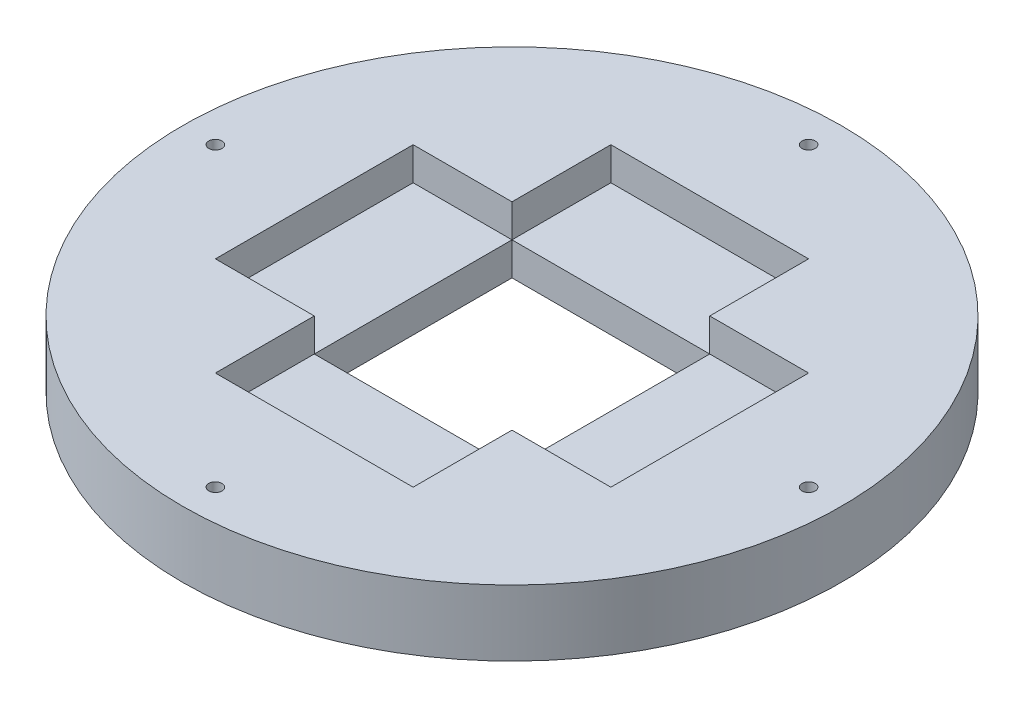
ISO-10303-21;
HEADER;
FILE_DESCRIPTION(('STEP AP214'),'2;1');
FILE_NAME('part.step','',(''),(''),'','','');
FILE_SCHEMA(('AUTOMOTIVE_DESIGN { 1 0 10303 214 1 1 1 1 }'));
ENDSEC;
DATA;
#1=APPLICATION_CONTEXT('core data for automotive mechanical design processes');
#2=APPLICATION_PROTOCOL_DEFINITION('international standard','automotive_design',2000,#1);
#3=PRODUCT_CONTEXT('',#1,'mechanical');
#4=PRODUCT('Part','Part','',(#3));
#5=PRODUCT_RELATED_PRODUCT_CATEGORY('part','',(#4));
#6=PRODUCT_DEFINITION_FORMATION('','',#4);
#7=PRODUCT_DEFINITION_CONTEXT('part definition',#1,'design');
#8=PRODUCT_DEFINITION('design','',#6,#7);
#9=PRODUCT_DEFINITION_SHAPE('','',#8);
#10=(LENGTH_UNIT() NAMED_UNIT(*) SI_UNIT(.MILLI.,.METRE.));
#11=(NAMED_UNIT(*) PLANE_ANGLE_UNIT() SI_UNIT($,.RADIAN.));
#12=(NAMED_UNIT(*) SI_UNIT($,.STERADIAN.) SOLID_ANGLE_UNIT());
#13=UNCERTAINTY_MEASURE_WITH_UNIT(LENGTH_MEASURE(1.E-05),#10,'distance_accuracy_value','');
#14=(GEOMETRIC_REPRESENTATION_CONTEXT(3) GLOBAL_UNCERTAINTY_ASSIGNED_CONTEXT((#13)) GLOBAL_UNIT_ASSIGNED_CONTEXT((#10,
#11,#12)) REPRESENTATION_CONTEXT('',''));
#15=CARTESIAN_POINT('',(0.,0.,0.));
#16=DIRECTION('',(0.,0.,1.));
#17=DIRECTION('',(1.,0.,0.));
#18=AXIS2_PLACEMENT_3D('',#15,#16,#17);
#19=CARTESIAN_POINT('',(-30.,20.,0.));
#20=DIRECTION('',(1.,0.,0.));
#21=DIRECTION('',(0.,0.,-1.));
#22=AXIS2_PLACEMENT_3D('',#19,#20,#21);
#23=PLANE('',#22);
#24=DIRECTION('',(0.,0.,1.));
#25=VECTOR('',#24,1.);
#26=CARTESIAN_POINT('',(-30.,10.,0.));
#27=LINE('',#26,#25);
#28=CARTESIAN_POINT('',(-30.,10.,30.));
#29=VERTEX_POINT('',#28);
#30=CARTESIAN_POINT('',(-30.,10.,60.));
#31=VERTEX_POINT('',#30);
#32=EDGE_CURVE('E233',#29,#31,#27,.T.);
#33=ORIENTED_EDGE('',*,*,#32,.F.);
#34=DIRECTION('',(0.,1.,0.));
#35=VECTOR('',#34,1.);
#36=CARTESIAN_POINT('',(-30.,10.,30.));
#37=LINE('',#36,#35);
#38=CARTESIAN_POINT('',(-30.,20.,30.));
#39=VERTEX_POINT('',#38);
#40=EDGE_CURVE('E176',#29,#39,#37,.T.);
#41=ORIENTED_EDGE('',*,*,#40,.T.);
#42=DIRECTION('',(0.,0.,1.));
#43=VECTOR('',#42,1.);
#44=CARTESIAN_POINT('',(-30.,20.,0.));
#45=LINE('',#44,#43);
#46=CARTESIAN_POINT('',(-30.,20.,60.));
#47=VERTEX_POINT('',#46);
#48=EDGE_CURVE('E249',#39,#47,#45,.T.);
#49=ORIENTED_EDGE('',*,*,#48,.T.);
#50=DIRECTION('',(0.,1.,0.));
#51=VECTOR('',#50,1.);
#52=CARTESIAN_POINT('',(-30.,10.,60.));
#53=LINE('',#52,#51);
#54=EDGE_CURVE('E239',#31,#47,#53,.T.);
#55=ORIENTED_EDGE('',*,*,#54,.F.);
#56=EDGE_LOOP('',(#33,#41,#49,#55));
#57=FACE_BOUND('',#56,.T.);
#58=ADVANCED_FACE('F33',(#57),#23,.T.);
#59=DIRECTION('',(0.,-1.,0.));
#60=VECTOR('',#59,1.);
#61=CARTESIAN_POINT('',(-30.,20.,-30.));
#62=LINE('',#61,#60);
#63=CARTESIAN_POINT('',(-30.,10.,-30.));
#64=VERTEX_POINT('',#63);
#65=CARTESIAN_POINT('',(-30.,0.,-30.));
#66=VERTEX_POINT('',#65);
#67=EDGE_CURVE('E48',#64,#66,#62,.T.);
#68=ORIENTED_EDGE('',*,*,#67,.F.);
#69=DIRECTION('',(0.,0.,-1.));
#70=VECTOR('',#69,1.);
#71=CARTESIAN_POINT('',(-30.,10.,0.));
#72=LINE('',#71,#70);
#73=EDGE_CURVE('E148',#29,#64,#72,.T.);
#74=ORIENTED_EDGE('',*,*,#73,.F.);
#75=DIRECTION('',(0.,-1.,0.));
#76=VECTOR('',#75,1.);
#77=CARTESIAN_POINT('',(-30.,20.,30.));
#78=LINE('',#77,#76);
#79=CARTESIAN_POINT('',(-30.,0.,30.));
#80=VERTEX_POINT('',#79);
#81=EDGE_CURVE('E56',#29,#80,#78,.T.);
#82=ORIENTED_EDGE('',*,*,#81,.T.);
#83=DIRECTION('',(0.,0.,1.));
#84=VECTOR('',#83,1.);
#85=CARTESIAN_POINT('',(-30.,0.,0.));
#86=LINE('',#85,#84);
#87=EDGE_CURVE('E264',#66,#80,#86,.T.);
#88=ORIENTED_EDGE('',*,*,#87,.F.);
#89=EDGE_LOOP('',(#68,#74,#82,#88));
#90=FACE_BOUND('',#89,.T.);
#91=ADVANCED_FACE('F283',(#90),#23,.T.);
#92=CARTESIAN_POINT('',(30.,20.,0.));
#93=DIRECTION('',(1.,0.,0.));
#94=DIRECTION('',(0.,0.,-1.));
#95=AXIS2_PLACEMENT_3D('',#92,#93,#94);
#96=PLANE('',#95);
#97=DIRECTION('',(0.,1.,0.));
#98=VECTOR('',#97,1.);
#99=CARTESIAN_POINT('',(30.,10.,-30.));
#100=LINE('',#99,#98);
#101=CARTESIAN_POINT('',(30.,10.,-30.));
#102=VERTEX_POINT('',#101);
#103=CARTESIAN_POINT('',(30.,20.,-30.));
#104=VERTEX_POINT('',#103);
#105=EDGE_CURVE('E203',#102,#104,#100,.T.);
#106=ORIENTED_EDGE('',*,*,#105,.T.);
#107=DIRECTION('',(0.,0.,1.));
#108=VECTOR('',#107,1.);
#109=CARTESIAN_POINT('',(30.,20.,0.));
#110=LINE('',#109,#108);
#111=CARTESIAN_POINT('',(30.,20.,-60.));
#112=VERTEX_POINT('',#111);
#113=EDGE_CURVE('E246',#112,#104,#110,.T.);
#114=ORIENTED_EDGE('',*,*,#113,.F.);
#115=DIRECTION('',(0.,1.,0.));
#116=VECTOR('',#115,1.);
#117=CARTESIAN_POINT('',(30.,10.,-60.));
#118=LINE('',#117,#116);
#119=CARTESIAN_POINT('',(30.,10.,-60.));
#120=VERTEX_POINT('',#119);
#121=EDGE_CURVE('E218',#120,#112,#118,.T.);
#122=ORIENTED_EDGE('',*,*,#121,.F.);
#123=DIRECTION('',(0.,0.,-1.));
#124=VECTOR('',#123,1.);
#125=CARTESIAN_POINT('',(30.,10.,0.));
#126=LINE('',#125,#124);
#127=EDGE_CURVE('E210',#102,#120,#126,.T.);
#128=ORIENTED_EDGE('',*,*,#127,.F.);
#129=EDGE_LOOP('',(#106,#114,#122,#128));
#130=FACE_BOUND('',#129,.T.);
#131=ADVANCED_FACE('F316',(#130),#96,.F.);
#132=DIRECTION('',(0.,0.,1.));
#133=VECTOR('',#132,1.);
#134=CARTESIAN_POINT('',(30.,10.,0.));
#135=LINE('',#134,#133);
#136=CARTESIAN_POINT('',(30.,10.,30.));
#137=VERTEX_POINT('',#136);
#138=EDGE_CURVE('E185',#102,#137,#135,.T.);
#139=ORIENTED_EDGE('',*,*,#138,.F.);
#140=DIRECTION('',(0.,-1.,0.));
#141=VECTOR('',#140,1.);
#142=CARTESIAN_POINT('',(30.,20.,-30.));
#143=LINE('',#142,#141);
#144=CARTESIAN_POINT('',(30.,0.,-30.));
#145=VERTEX_POINT('',#144);
#146=EDGE_CURVE('E11',#102,#145,#143,.T.);
#147=ORIENTED_EDGE('',*,*,#146,.T.);
#148=DIRECTION('',(0.,0.,1.));
#149=VECTOR('',#148,1.);
#150=CARTESIAN_POINT('',(30.,0.,0.));
#151=LINE('',#150,#149);
#152=CARTESIAN_POINT('',(30.,0.,30.));
#153=VERTEX_POINT('',#152);
#154=EDGE_CURVE('E258',#145,#153,#151,.T.);
#155=ORIENTED_EDGE('',*,*,#154,.T.);
#156=DIRECTION('',(0.,-1.,0.));
#157=VECTOR('',#156,1.);
#158=CARTESIAN_POINT('',(30.,20.,30.));
#159=LINE('',#158,#157);
#160=EDGE_CURVE('E41',#137,#153,#159,.T.);
#161=ORIENTED_EDGE('',*,*,#160,.F.);
#162=EDGE_LOOP('',(#139,#147,#155,#161));
#163=FACE_BOUND('',#162,.T.);
#164=ADVANCED_FACE('F278',(#163),#96,.F.);
#165=CARTESIAN_POINT('',(0.,20.,-30.));
#166=DIRECTION('',(0.,0.,-1.));
#167=DIRECTION('',(-1.,0.,0.));
#168=AXIS2_PLACEMENT_3D('',#165,#166,#167);
#169=PLANE('',#168);
#170=DIRECTION('',(1.,0.,0.));
#171=VECTOR('',#170,1.);
#172=CARTESIAN_POINT('',(0.,10.,-30.));
#173=LINE('',#172,#171);
#174=EDGE_CURVE('E207',#64,#102,#173,.T.);
#175=ORIENTED_EDGE('',*,*,#174,.F.);
#176=ORIENTED_EDGE('',*,*,#67,.T.);
#177=DIRECTION('',(1.,0.,0.));
#178=VECTOR('',#177,1.);
#179=CARTESIAN_POINT('',(0.,0.,-30.));
#180=LINE('',#179,#178);
#181=EDGE_CURVE('E225',#66,#145,#180,.T.);
#182=ORIENTED_EDGE('',*,*,#181,.T.);
#183=ORIENTED_EDGE('',*,*,#146,.F.);
#184=EDGE_LOOP('',(#175,#176,#182,#183));
#185=FACE_BOUND('',#184,.T.);
#186=ADVANCED_FACE('F35',(#185),#169,.F.);
#187=CARTESIAN_POINT('',(0.,20.,30.));
#188=DIRECTION('',(0.,0.,-1.));
#189=DIRECTION('',(-1.,0.,0.));
#190=AXIS2_PLACEMENT_3D('',#187,#188,#189);
#191=PLANE('',#190);
#192=ORIENTED_EDGE('',*,*,#81,.F.);
#193=DIRECTION('',(-1.,0.,0.));
#194=VECTOR('',#193,1.);
#195=CARTESIAN_POINT('',(0.,10.,30.));
#196=LINE('',#195,#194);
#197=EDGE_CURVE('E230',#137,#29,#196,.T.);
#198=ORIENTED_EDGE('',*,*,#197,.F.);
#199=ORIENTED_EDGE('',*,*,#160,.T.);
#200=DIRECTION('',(1.,0.,0.));
#201=VECTOR('',#200,1.);
#202=CARTESIAN_POINT('',(0.,0.,30.));
#203=LINE('',#202,#201);
#204=EDGE_CURVE('E261',#80,#153,#203,.T.);
#205=ORIENTED_EDGE('',*,*,#204,.F.);
#206=EDGE_LOOP('',(#192,#198,#199,#205));
#207=FACE_BOUND('',#206,.T.);
#208=ADVANCED_FACE('F274',(#207),#191,.T.);
#209=CARTESIAN_POINT('',(0.,20.,0.));
#210=DIRECTION('',(0.,1.,0.));
#211=DIRECTION('',(0.,0.,1.));
#212=AXIS2_PLACEMENT_3D('',#209,#210,#211);
#213=PLANE('',#212);
#214=CARTESIAN_POINT('',(0.,20.,-90.));
#215=DIRECTION('',(0.,1.,0.));
#216=DIRECTION('',(0.,0.,1.));
#217=AXIS2_PLACEMENT_3D('',#214,#215,#216);
#218=CIRCLE('',#217,2.);
#219=CARTESIAN_POINT('',(0.,20.,-88.));
#220=VERTEX_POINT('',#219);
#221=EDGE_CURVE('E410',#220,#220,#218,.T.);
#222=ORIENTED_EDGE('',*,*,#221,.F.);
#223=EDGE_LOOP('',(#222));
#224=FACE_BOUND('',#223,.T.);
#225=CARTESIAN_POINT('',(90.,20.,0.));
#226=DIRECTION('',(0.,1.,0.));
#227=DIRECTION('',(0.,0.,1.));
#228=AXIS2_PLACEMENT_3D('',#225,#226,#227);
#229=CIRCLE('',#228,2.);
#230=CARTESIAN_POINT('',(90.,20.,2.));
#231=VERTEX_POINT('',#230);
#232=EDGE_CURVE('E406',#231,#231,#229,.T.);
#233=ORIENTED_EDGE('',*,*,#232,.F.);
#234=EDGE_LOOP('',(#233));
#235=FACE_BOUND('',#234,.T.);
#236=CARTESIAN_POINT('',(0.,20.,90.));
#237=DIRECTION('',(0.,1.,0.));
#238=DIRECTION('',(0.,0.,1.));
#239=AXIS2_PLACEMENT_3D('',#236,#237,#238);
#240=CIRCLE('',#239,2.00000000000001);
#241=CARTESIAN_POINT('',(0.,20.,92.));
#242=VERTEX_POINT('',#241);
#243=EDGE_CURVE('E400',#242,#242,#240,.T.);
#244=ORIENTED_EDGE('',*,*,#243,.F.);
#245=EDGE_LOOP('',(#244));
#246=FACE_BOUND('',#245,.T.);
#247=CARTESIAN_POINT('',(-90.,20.,0.));
#248=DIRECTION('',(0.,1.,0.));
#249=DIRECTION('',(0.,0.,1.));
#250=AXIS2_PLACEMENT_3D('',#247,#248,#249);
#251=CIRCLE('',#250,2.00000000000001);
#252=CARTESIAN_POINT('',(-90.,20.,2.00000000000001));
#253=VERTEX_POINT('',#252);
#254=EDGE_CURVE('E165',#253,#253,#251,.T.);
#255=ORIENTED_EDGE('',*,*,#254,.F.);
#256=EDGE_LOOP('',(#255));
#257=FACE_BOUND('',#256,.T.);
#258=DIRECTION('',(-1.,0.,0.));
#259=VECTOR('',#258,1.);
#260=CARTESIAN_POINT('',(0.,20.,-30.));
#261=LINE('',#260,#259);
#262=CARTESIAN_POINT('',(-30.,20.,-30.));
#263=VERTEX_POINT('',#262);
#264=CARTESIAN_POINT('',(-60.,20.,-30.));
#265=VERTEX_POINT('',#264);
#266=EDGE_CURVE('E143',#263,#265,#261,.T.);
#267=ORIENTED_EDGE('',*,*,#266,.F.);
#268=CARTESIAN_POINT('',(-30.,20.,-60.));
#269=VERTEX_POINT('',#268);
#270=EDGE_CURVE('E251',#269,#263,#45,.T.);
#271=ORIENTED_EDGE('',*,*,#270,.F.);
#272=DIRECTION('',(1.,0.,0.));
#273=VECTOR('',#272,1.);
#274=CARTESIAN_POINT('',(0.,20.,-60.));
#275=LINE('',#274,#273);
#276=EDGE_CURVE('E211',#269,#112,#275,.T.);
#277=ORIENTED_EDGE('',*,*,#276,.T.);
#278=ORIENTED_EDGE('',*,*,#113,.T.);
#279=DIRECTION('',(1.,0.,0.));
#280=VECTOR('',#279,1.);
#281=CARTESIAN_POINT('',(0.,20.,-30.));
#282=LINE('',#281,#280);
#283=CARTESIAN_POINT('',(60.,20.,-30.));
#284=VERTEX_POINT('',#283);
#285=EDGE_CURVE('E193',#104,#284,#282,.T.);
#286=ORIENTED_EDGE('',*,*,#285,.T.);
#287=DIRECTION('',(0.,0.,1.));
#288=VECTOR('',#287,1.);
#289=CARTESIAN_POINT('',(60.,20.,0.));
#290=LINE('',#289,#288);
#291=CARTESIAN_POINT('',(60.,20.,30.));
#292=VERTEX_POINT('',#291);
#293=EDGE_CURVE('E175',#284,#292,#290,.T.);
#294=ORIENTED_EDGE('',*,*,#293,.T.);
#295=DIRECTION('',(1.,0.,0.));
#296=VECTOR('',#295,1.);
#297=CARTESIAN_POINT('',(0.,20.,30.));
#298=LINE('',#297,#296);
#299=CARTESIAN_POINT('',(30.,20.,30.));
#300=VERTEX_POINT('',#299);
#301=EDGE_CURVE('E183',#300,#292,#298,.T.);
#302=ORIENTED_EDGE('',*,*,#301,.F.);
#303=CARTESIAN_POINT('',(30.,20.,60.));
#304=VERTEX_POINT('',#303);
#305=EDGE_CURVE('E250',#300,#304,#110,.T.);
#306=ORIENTED_EDGE('',*,*,#305,.T.);
#307=DIRECTION('',(1.,0.,0.));
#308=VECTOR('',#307,1.);
#309=CARTESIAN_POINT('',(0.,20.,60.));
#310=LINE('',#309,#308);
#311=EDGE_CURVE('E200',#47,#304,#310,.T.);
#312=ORIENTED_EDGE('',*,*,#311,.F.);
#313=ORIENTED_EDGE('',*,*,#48,.F.);
#314=DIRECTION('',(-1.,0.,0.));
#315=VECTOR('',#314,1.);
#316=CARTESIAN_POINT('',(0.,20.,30.));
#317=LINE('',#316,#315);
#318=CARTESIAN_POINT('',(-60.,20.,30.));
#319=VERTEX_POINT('',#318);
#320=EDGE_CURVE('E159',#39,#319,#317,.T.);
#321=ORIENTED_EDGE('',*,*,#320,.T.);
#322=DIRECTION('',(0.,0.,1.));
#323=VECTOR('',#322,1.);
#324=CARTESIAN_POINT('',(-60.,20.,0.));
#325=LINE('',#324,#323);
#326=EDGE_CURVE('E162',#265,#319,#325,.T.);
#327=ORIENTED_EDGE('',*,*,#326,.F.);
#328=EDGE_LOOP('',(#267,#271,#277,#278,#286,#294,#302,#306,#312,#313,#321,#327));
#329=FACE_BOUND('',#328,.T.);
#330=CARTESIAN_POINT('',(0.,20.,0.));
#331=DIRECTION('',(0.,1.,0.));
#332=DIRECTION('',(0.,0.,1.));
#333=AXIS2_PLACEMENT_3D('',#330,#331,#332);
#334=CIRCLE('',#333,100.);
#335=CARTESIAN_POINT('',(0.,20.,100.));
#336=VERTEX_POINT('',#335);
#337=EDGE_CURVE('E254',#336,#336,#334,.T.);
#338=ORIENTED_EDGE('',*,*,#337,.T.);
#339=EDGE_LOOP('',(#338));
#340=FACE_BOUND('',#339,.T.);
#341=ADVANCED_FACE('F301',(#224,#235,#246,#257,#329,#340),#213,.T.);
#342=ORIENTED_EDGE('',*,*,#305,.F.);
#343=DIRECTION('',(0.,1.,0.));
#344=VECTOR('',#343,1.);
#345=CARTESIAN_POINT('',(30.,10.,30.));
#346=LINE('',#345,#344);
#347=EDGE_CURVE('E201',#137,#300,#346,.T.);
#348=ORIENTED_EDGE('',*,*,#347,.F.);
#349=DIRECTION('',(0.,0.,1.));
#350=VECTOR('',#349,1.);
#351=CARTESIAN_POINT('',(30.,10.,0.));
#352=LINE('',#351,#350);
#353=CARTESIAN_POINT('',(30.,10.,60.));
#354=VERTEX_POINT('',#353);
#355=EDGE_CURVE('E228',#137,#354,#352,.T.);
#356=ORIENTED_EDGE('',*,*,#355,.T.);
#357=DIRECTION('',(0.,1.,0.));
#358=VECTOR('',#357,1.);
#359=CARTESIAN_POINT('',(30.,10.,60.));
#360=LINE('',#359,#358);
#361=EDGE_CURVE('E221',#354,#304,#360,.T.);
#362=ORIENTED_EDGE('',*,*,#361,.T.);
#363=EDGE_LOOP('',(#342,#348,#356,#362));
#364=FACE_BOUND('',#363,.T.);
#365=ADVANCED_FACE('F296',(#364),#96,.F.);
#366=DIRECTION('',(0.,1.,0.));
#367=VECTOR('',#366,1.);
#368=CARTESIAN_POINT('',(-30.,10.,-30.));
#369=LINE('',#368,#367);
#370=EDGE_CURVE('E173',#64,#263,#369,.T.);
#371=ORIENTED_EDGE('',*,*,#370,.F.);
#372=DIRECTION('',(0.,0.,-1.));
#373=VECTOR('',#372,1.);
#374=CARTESIAN_POINT('',(-30.,10.,0.));
#375=LINE('',#374,#373);
#376=CARTESIAN_POINT('',(-30.,10.,-60.));
#377=VERTEX_POINT('',#376);
#378=EDGE_CURVE('E216',#64,#377,#375,.T.);
#379=ORIENTED_EDGE('',*,*,#378,.T.);
#380=DIRECTION('',(0.,1.,0.));
#381=VECTOR('',#380,1.);
#382=CARTESIAN_POINT('',(-30.,10.,-60.));
#383=LINE('',#382,#381);
#384=EDGE_CURVE('E222',#377,#269,#383,.T.);
#385=ORIENTED_EDGE('',*,*,#384,.T.);
#386=ORIENTED_EDGE('',*,*,#270,.T.);
#387=EDGE_LOOP('',(#371,#379,#385,#386));
#388=FACE_BOUND('',#387,.T.);
#389=ADVANCED_FACE('F329',(#388),#23,.T.);
#390=CARTESIAN_POINT('',(0.,20.,0.));
#391=DIRECTION('',(0.,-1.,0.));
#392=DIRECTION('',(0.,0.,-1.));
#393=AXIS2_PLACEMENT_3D('',#390,#391,#392);
#394=CYLINDRICAL_SURFACE('',#393,100.);
#395=ORIENTED_EDGE('',*,*,#337,.F.);
#396=EDGE_LOOP('',(#395));
#397=FACE_BOUND('',#396,.T.);
#398=CARTESIAN_POINT('',(0.,0.,0.));
#399=DIRECTION('',(0.,1.,0.));
#400=DIRECTION('',(0.,0.,1.));
#401=AXIS2_PLACEMENT_3D('',#398,#399,#400);
#402=CIRCLE('',#401,100.);
#403=CARTESIAN_POINT('',(0.,0.,100.));
#404=VERTEX_POINT('',#403);
#405=EDGE_CURVE('E267',#404,#404,#402,.T.);
#406=ORIENTED_EDGE('',*,*,#405,.T.);
#407=EDGE_LOOP('',(#406));
#408=FACE_BOUND('',#407,.T.);
#409=ADVANCED_FACE('F335',(#397,#408),#394,.T.);
#410=CARTESIAN_POINT('',(0.,0.,0.));
#411=DIRECTION('',(0.,1.,0.));
#412=DIRECTION('',(0.,0.,1.));
#413=AXIS2_PLACEMENT_3D('',#410,#411,#412);
#414=PLANE('',#413);
#415=CARTESIAN_POINT('',(0.,0.,-90.));
#416=DIRECTION('',(0.,1.,0.));
#417=DIRECTION('',(0.,0.,1.));
#418=AXIS2_PLACEMENT_3D('',#415,#416,#417);
#419=CIRCLE('',#418,2.);
#420=CARTESIAN_POINT('',(0.,0.,-88.));
#421=VERTEX_POINT('',#420);
#422=EDGE_CURVE('E171',#421,#421,#419,.T.);
#423=ORIENTED_EDGE('',*,*,#422,.T.);
#424=EDGE_LOOP('',(#423));
#425=FACE_BOUND('',#424,.T.);
#426=CARTESIAN_POINT('',(90.,0.,0.));
#427=DIRECTION('',(0.,1.,0.));
#428=DIRECTION('',(0.,0.,1.));
#429=AXIS2_PLACEMENT_3D('',#426,#427,#428);
#430=CIRCLE('',#429,2.);
#431=CARTESIAN_POINT('',(90.,0.,2.));
#432=VERTEX_POINT('',#431);
#433=EDGE_CURVE('E391',#432,#432,#430,.T.);
#434=ORIENTED_EDGE('',*,*,#433,.T.);
#435=EDGE_LOOP('',(#434));
#436=FACE_BOUND('',#435,.T.);
#437=CARTESIAN_POINT('',(0.,0.,90.));
#438=DIRECTION('',(0.,1.,0.));
#439=DIRECTION('',(0.,0.,1.));
#440=AXIS2_PLACEMENT_3D('',#437,#438,#439);
#441=CIRCLE('',#440,2.00000000000001);
#442=CARTESIAN_POINT('',(0.,0.,92.));
#443=VERTEX_POINT('',#442);
#444=EDGE_CURVE('E395',#443,#443,#441,.T.);
#445=ORIENTED_EDGE('',*,*,#444,.T.);
#446=EDGE_LOOP('',(#445));
#447=FACE_BOUND('',#446,.T.);
#448=CARTESIAN_POINT('',(-90.,0.,0.));
#449=DIRECTION('',(0.,1.,0.));
#450=DIRECTION('',(0.,0.,1.));
#451=AXIS2_PLACEMENT_3D('',#448,#449,#450);
#452=CIRCLE('',#451,2.00000000000001);
#453=CARTESIAN_POINT('',(-90.,0.,2.00000000000001));
#454=VERTEX_POINT('',#453);
#455=EDGE_CURVE('E398',#454,#454,#452,.T.);
#456=ORIENTED_EDGE('',*,*,#455,.T.);
#457=EDGE_LOOP('',(#456));
#458=FACE_BOUND('',#457,.T.);
#459=ORIENTED_EDGE('',*,*,#181,.F.);
#460=ORIENTED_EDGE('',*,*,#87,.T.);
#461=ORIENTED_EDGE('',*,*,#204,.T.);
#462=ORIENTED_EDGE('',*,*,#154,.F.);
#463=EDGE_LOOP('',(#459,#460,#461,#462));
#464=FACE_BOUND('',#463,.T.);
#465=ORIENTED_EDGE('',*,*,#405,.F.);
#466=EDGE_LOOP('',(#465));
#467=FACE_BOUND('',#466,.T.);
#468=ADVANCED_FACE('F281',(#425,#436,#447,#458,#464,#467),#414,.F.);
#469=CARTESIAN_POINT('',(0.,10.,60.));
#470=DIRECTION('',(0.,0.,1.));
#471=DIRECTION('',(1.,0.,0.));
#472=AXIS2_PLACEMENT_3D('',#469,#470,#471);
#473=PLANE('',#472);
#474=ORIENTED_EDGE('',*,*,#311,.T.);
#475=ORIENTED_EDGE('',*,*,#361,.F.);
#476=DIRECTION('',(1.,0.,0.));
#477=VECTOR('',#476,1.);
#478=CARTESIAN_POINT('',(0.,10.,60.));
#479=LINE('',#478,#477);
#480=EDGE_CURVE('E236',#31,#354,#479,.T.);
#481=ORIENTED_EDGE('',*,*,#480,.F.);
#482=ORIENTED_EDGE('',*,*,#54,.T.);
#483=EDGE_LOOP('',(#474,#475,#481,#482));
#484=FACE_BOUND('',#483,.T.);
#485=ADVANCED_FACE('F298',(#484),#473,.F.);
#486=CARTESIAN_POINT('',(0.,10.,0.));
#487=DIRECTION('',(0.,1.,0.));
#488=DIRECTION('',(0.,0.,1.));
#489=AXIS2_PLACEMENT_3D('',#486,#487,#488);
#490=PLANE('',#489);
#491=ORIENTED_EDGE('',*,*,#355,.F.);
#492=ORIENTED_EDGE('',*,*,#197,.T.);
#493=ORIENTED_EDGE('',*,*,#32,.T.);
#494=ORIENTED_EDGE('',*,*,#480,.T.);
#495=EDGE_LOOP('',(#491,#492,#493,#494));
#496=FACE_BOUND('',#495,.T.);
#497=ADVANCED_FACE('F291',(#496),#490,.T.);
#498=CARTESIAN_POINT('',(0.,10.,-60.));
#499=DIRECTION('',(0.,0.,1.));
#500=DIRECTION('',(1.,0.,0.));
#501=AXIS2_PLACEMENT_3D('',#498,#499,#500);
#502=PLANE('',#501);
#503=ORIENTED_EDGE('',*,*,#276,.F.);
#504=ORIENTED_EDGE('',*,*,#384,.F.);
#505=DIRECTION('',(1.,0.,0.));
#506=VECTOR('',#505,1.);
#507=CARTESIAN_POINT('',(0.,10.,-60.));
#508=LINE('',#507,#506);
#509=EDGE_CURVE('E214',#377,#120,#508,.T.);
#510=ORIENTED_EDGE('',*,*,#509,.T.);
#511=ORIENTED_EDGE('',*,*,#121,.T.);
#512=EDGE_LOOP('',(#503,#504,#510,#511));
#513=FACE_BOUND('',#512,.T.);
#514=ADVANCED_FACE('F370',(#513),#502,.T.);
#515=CARTESIAN_POINT('',(0.,10.,0.));
#516=DIRECTION('',(0.,1.,0.));
#517=DIRECTION('',(0.,0.,1.));
#518=AXIS2_PLACEMENT_3D('',#515,#516,#517);
#519=PLANE('',#518);
#520=ORIENTED_EDGE('',*,*,#174,.T.);
#521=ORIENTED_EDGE('',*,*,#127,.T.);
#522=ORIENTED_EDGE('',*,*,#509,.F.);
#523=ORIENTED_EDGE('',*,*,#378,.F.);
#524=EDGE_LOOP('',(#520,#521,#522,#523));
#525=FACE_BOUND('',#524,.T.);
#526=ADVANCED_FACE('F320',(#525),#519,.T.);
#527=CARTESIAN_POINT('',(60.,10.,0.));
#528=DIRECTION('',(-1.,0.,0.));
#529=DIRECTION('',(0.,0.,1.));
#530=AXIS2_PLACEMENT_3D('',#527,#528,#529);
#531=PLANE('',#530);
#532=ORIENTED_EDGE('',*,*,#293,.F.);
#533=DIRECTION('',(0.,1.,0.));
#534=VECTOR('',#533,1.);
#535=CARTESIAN_POINT('',(60.,10.,-30.));
#536=LINE('',#535,#534);
#537=CARTESIAN_POINT('',(60.,10.,-30.));
#538=VERTEX_POINT('',#537);
#539=EDGE_CURVE('E190',#538,#284,#536,.T.);
#540=ORIENTED_EDGE('',*,*,#539,.F.);
#541=DIRECTION('',(0.,0.,1.));
#542=VECTOR('',#541,1.);
#543=CARTESIAN_POINT('',(60.,10.,0.));
#544=LINE('',#543,#542);
#545=CARTESIAN_POINT('',(60.,10.,30.));
#546=VERTEX_POINT('',#545);
#547=EDGE_CURVE('E180',#538,#546,#544,.T.);
#548=ORIENTED_EDGE('',*,*,#547,.T.);
#549=DIRECTION('',(0.,1.,0.));
#550=VECTOR('',#549,1.);
#551=CARTESIAN_POINT('',(60.,10.,30.));
#552=LINE('',#551,#550);
#553=EDGE_CURVE('E198',#546,#292,#552,.T.);
#554=ORIENTED_EDGE('',*,*,#553,.T.);
#555=EDGE_LOOP('',(#532,#540,#548,#554));
#556=FACE_BOUND('',#555,.T.);
#557=ADVANCED_FACE('F361',(#556),#531,.T.);
#558=CARTESIAN_POINT('',(0.,10.,30.));
#559=DIRECTION('',(0.,0.,1.));
#560=DIRECTION('',(1.,0.,0.));
#561=AXIS2_PLACEMENT_3D('',#558,#559,#560);
#562=PLANE('',#561);
#563=ORIENTED_EDGE('',*,*,#301,.T.);
#564=ORIENTED_EDGE('',*,*,#553,.F.);
#565=DIRECTION('',(1.,0.,0.));
#566=VECTOR('',#565,1.);
#567=CARTESIAN_POINT('',(0.,10.,30.));
#568=LINE('',#567,#566);
#569=EDGE_CURVE('E187',#137,#546,#568,.T.);
#570=ORIENTED_EDGE('',*,*,#569,.F.);
#571=ORIENTED_EDGE('',*,*,#347,.T.);
#572=EDGE_LOOP('',(#563,#564,#570,#571));
#573=FACE_BOUND('',#572,.T.);
#574=ADVANCED_FACE('F307',(#573),#562,.F.);
#575=CARTESIAN_POINT('',(0.,10.,-30.));
#576=DIRECTION('',(0.,0.,1.));
#577=DIRECTION('',(1.,0.,0.));
#578=AXIS2_PLACEMENT_3D('',#575,#576,#577);
#579=PLANE('',#578);
#580=ORIENTED_EDGE('',*,*,#285,.F.);
#581=ORIENTED_EDGE('',*,*,#105,.F.);
#582=DIRECTION('',(1.,0.,0.));
#583=VECTOR('',#582,1.);
#584=CARTESIAN_POINT('',(0.,10.,-30.));
#585=LINE('',#584,#583);
#586=EDGE_CURVE('E182',#102,#538,#585,.T.);
#587=ORIENTED_EDGE('',*,*,#586,.T.);
#588=ORIENTED_EDGE('',*,*,#539,.T.);
#589=EDGE_LOOP('',(#580,#581,#587,#588));
#590=FACE_BOUND('',#589,.T.);
#591=ADVANCED_FACE('F358',(#590),#579,.T.);
#592=CARTESIAN_POINT('',(0.,10.,0.));
#593=DIRECTION('',(0.,1.,0.));
#594=DIRECTION('',(0.,0.,1.));
#595=AXIS2_PLACEMENT_3D('',#592,#593,#594);
#596=PLANE('',#595);
#597=ORIENTED_EDGE('',*,*,#547,.F.);
#598=ORIENTED_EDGE('',*,*,#586,.F.);
#599=ORIENTED_EDGE('',*,*,#138,.T.);
#600=ORIENTED_EDGE('',*,*,#569,.T.);
#601=EDGE_LOOP('',(#597,#598,#599,#600));
#602=FACE_BOUND('',#601,.T.);
#603=ADVANCED_FACE('F311',(#602),#596,.T.);
#604=CARTESIAN_POINT('',(0.,10.,-30.));
#605=DIRECTION('',(0.,0.,-1.));
#606=DIRECTION('',(-1.,0.,0.));
#607=AXIS2_PLACEMENT_3D('',#604,#605,#606);
#608=PLANE('',#607);
#609=ORIENTED_EDGE('',*,*,#266,.T.);
#610=DIRECTION('',(0.,1.,0.));
#611=VECTOR('',#610,1.);
#612=CARTESIAN_POINT('',(-60.,10.,-30.));
#613=LINE('',#612,#611);
#614=CARTESIAN_POINT('',(-60.,10.,-30.));
#615=VERTEX_POINT('',#614);
#616=EDGE_CURVE('E136',#615,#265,#613,.T.);
#617=ORIENTED_EDGE('',*,*,#616,.F.);
#618=DIRECTION('',(-1.,0.,0.));
#619=VECTOR('',#618,1.);
#620=CARTESIAN_POINT('',(0.,10.,-30.));
#621=LINE('',#620,#619);
#622=EDGE_CURVE('E140',#64,#615,#621,.T.);
#623=ORIENTED_EDGE('',*,*,#622,.F.);
#624=ORIENTED_EDGE('',*,*,#370,.T.);
#625=EDGE_LOOP('',(#609,#617,#623,#624));
#626=FACE_BOUND('',#625,.T.);
#627=ADVANCED_FACE('F138',(#626),#608,.F.);
#628=CARTESIAN_POINT('',(0.,10.,30.));
#629=DIRECTION('',(0.,0.,-1.));
#630=DIRECTION('',(-1.,0.,0.));
#631=AXIS2_PLACEMENT_3D('',#628,#629,#630);
#632=PLANE('',#631);
#633=ORIENTED_EDGE('',*,*,#320,.F.);
#634=ORIENTED_EDGE('',*,*,#40,.F.);
#635=DIRECTION('',(-1.,0.,0.));
#636=VECTOR('',#635,1.);
#637=CARTESIAN_POINT('',(0.,10.,30.));
#638=LINE('',#637,#636);
#639=CARTESIAN_POINT('',(-60.,10.,30.));
#640=VERTEX_POINT('',#639);
#641=EDGE_CURVE('E155',#29,#640,#638,.T.);
#642=ORIENTED_EDGE('',*,*,#641,.T.);
#643=DIRECTION('',(0.,1.,0.));
#644=VECTOR('',#643,1.);
#645=CARTESIAN_POINT('',(-60.,10.,30.));
#646=LINE('',#645,#644);
#647=EDGE_CURVE('E147',#640,#319,#646,.T.);
#648=ORIENTED_EDGE('',*,*,#647,.T.);
#649=EDGE_LOOP('',(#633,#634,#642,#648));
#650=FACE_BOUND('',#649,.T.);
#651=ADVANCED_FACE('F344',(#650),#632,.T.);
#652=CARTESIAN_POINT('',(-60.,10.,0.));
#653=DIRECTION('',(-1.,0.,0.));
#654=DIRECTION('',(0.,0.,1.));
#655=AXIS2_PLACEMENT_3D('',#652,#653,#654);
#656=PLANE('',#655);
#657=ORIENTED_EDGE('',*,*,#326,.T.);
#658=ORIENTED_EDGE('',*,*,#647,.F.);
#659=DIRECTION('',(0.,0.,1.));
#660=VECTOR('',#659,1.);
#661=CARTESIAN_POINT('',(-60.,10.,0.));
#662=LINE('',#661,#660);
#663=EDGE_CURVE('E152',#615,#640,#662,.T.);
#664=ORIENTED_EDGE('',*,*,#663,.F.);
#665=ORIENTED_EDGE('',*,*,#616,.T.);
#666=EDGE_LOOP('',(#657,#658,#664,#665));
#667=FACE_BOUND('',#666,.T.);
#668=ADVANCED_FACE('F153',(#667),#656,.F.);
#669=CARTESIAN_POINT('',(0.,10.,0.));
#670=DIRECTION('',(0.,1.,0.));
#671=DIRECTION('',(0.,0.,1.));
#672=AXIS2_PLACEMENT_3D('',#669,#670,#671);
#673=PLANE('',#672);
#674=ORIENTED_EDGE('',*,*,#622,.T.);
#675=ORIENTED_EDGE('',*,*,#663,.T.);
#676=ORIENTED_EDGE('',*,*,#641,.F.);
#677=ORIENTED_EDGE('',*,*,#73,.T.);
#678=EDGE_LOOP('',(#674,#675,#676,#677));
#679=FACE_BOUND('',#678,.T.);
#680=ADVANCED_FACE('F157',(#679),#673,.T.);
#681=CARTESIAN_POINT('',(-90.,0.,0.));
#682=DIRECTION('',(0.,1.,0.));
#683=DIRECTION('',(0.,0.,1.));
#684=AXIS2_PLACEMENT_3D('',#681,#682,#683);
#685=CYLINDRICAL_SURFACE('',#684,2.00000000000001);
#686=ORIENTED_EDGE('',*,*,#455,.F.);
#687=EDGE_LOOP('',(#686));
#688=FACE_BOUND('',#687,.T.);
#689=ORIENTED_EDGE('',*,*,#254,.T.);
#690=EDGE_LOOP('',(#689));
#691=FACE_BOUND('',#690,.T.);
#692=ADVANCED_FACE('F423',(#688,#691),#685,.F.);
#693=CARTESIAN_POINT('',(0.,0.,90.));
#694=DIRECTION('',(0.,1.,0.));
#695=DIRECTION('',(0.,0.,1.));
#696=AXIS2_PLACEMENT_3D('',#693,#694,#695);
#697=CYLINDRICAL_SURFACE('',#696,2.00000000000001);
#698=ORIENTED_EDGE('',*,*,#444,.F.);
#699=EDGE_LOOP('',(#698));
#700=FACE_BOUND('',#699,.T.);
#701=ORIENTED_EDGE('',*,*,#243,.T.);
#702=EDGE_LOOP('',(#701));
#703=FACE_BOUND('',#702,.T.);
#704=ADVANCED_FACE('F425',(#700,#703),#697,.F.);
#705=CARTESIAN_POINT('',(90.,0.,0.));
#706=DIRECTION('',(0.,1.,0.));
#707=DIRECTION('',(0.,0.,1.));
#708=AXIS2_PLACEMENT_3D('',#705,#706,#707);
#709=CYLINDRICAL_SURFACE('',#708,2.);
#710=ORIENTED_EDGE('',*,*,#433,.F.);
#711=EDGE_LOOP('',(#710));
#712=FACE_BOUND('',#711,.T.);
#713=ORIENTED_EDGE('',*,*,#232,.T.);
#714=EDGE_LOOP('',(#713));
#715=FACE_BOUND('',#714,.T.);
#716=ADVANCED_FACE('F430',(#712,#715),#709,.F.);
#717=CARTESIAN_POINT('',(0.,0.,-90.));
#718=DIRECTION('',(0.,1.,0.));
#719=DIRECTION('',(0.,0.,1.));
#720=AXIS2_PLACEMENT_3D('',#717,#718,#719);
#721=CYLINDRICAL_SURFACE('',#720,2.);
#722=ORIENTED_EDGE('',*,*,#422,.F.);
#723=EDGE_LOOP('',(#722));
#724=FACE_BOUND('',#723,.T.);
#725=ORIENTED_EDGE('',*,*,#221,.T.);
#726=EDGE_LOOP('',(#725));
#727=FACE_BOUND('',#726,.T.);
#728=ADVANCED_FACE('F415',(#724,#727),#721,.F.);
#729=CLOSED_SHELL('',(#58,#91,#131,#164,#186,#208,#341,#365,#389,#409,#468,#485,#497,#514,#526,
#557,#574,#591,#603,#627,#651,#668,#680,#692,#704,#716,#728));
#730=MANIFOLD_SOLID_BREP('B2',#729);
#731=ADVANCED_BREP_SHAPE_REPRESENTATION('',(#18,#730),#14);
#732=SHAPE_DEFINITION_REPRESENTATION(#9,#731);
ENDSEC;
END-ISO-10303-21;
